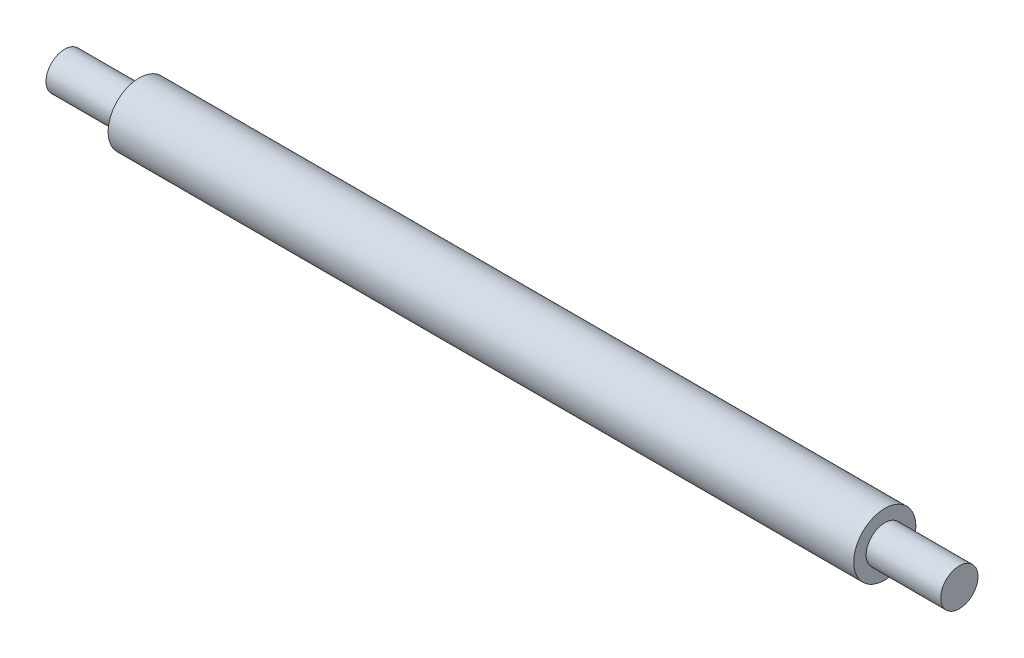
ISO-10303-21;
HEADER;
FILE_DESCRIPTION(('STEP AP214'),'2;1');
FILE_NAME('part.step','',(''),(''),'','','');
FILE_SCHEMA(('AUTOMOTIVE_DESIGN { 1 0 10303 214 1 1 1 1 }'));
ENDSEC;
DATA;
#1=APPLICATION_CONTEXT('core data for automotive mechanical design processes');
#2=APPLICATION_PROTOCOL_DEFINITION('international standard','automotive_design',2000,#1);
#3=PRODUCT_CONTEXT('',#1,'mechanical');
#4=PRODUCT('Part','Part','',(#3));
#5=PRODUCT_RELATED_PRODUCT_CATEGORY('part','',(#4));
#6=PRODUCT_DEFINITION_FORMATION('','',#4);
#7=PRODUCT_DEFINITION_CONTEXT('part definition',#1,'design');
#8=PRODUCT_DEFINITION('design','',#6,#7);
#9=PRODUCT_DEFINITION_SHAPE('','',#8);
#10=(LENGTH_UNIT() NAMED_UNIT(*) SI_UNIT(.MILLI.,.METRE.));
#11=(NAMED_UNIT(*) PLANE_ANGLE_UNIT() SI_UNIT($,.RADIAN.));
#12=(NAMED_UNIT(*) SI_UNIT($,.STERADIAN.) SOLID_ANGLE_UNIT());
#13=UNCERTAINTY_MEASURE_WITH_UNIT(LENGTH_MEASURE(1.E-05),#10,'distance_accuracy_value','');
#14=(GEOMETRIC_REPRESENTATION_CONTEXT(3) GLOBAL_UNCERTAINTY_ASSIGNED_CONTEXT((#13)) GLOBAL_UNIT_ASSIGNED_CONTEXT((#10,
#11,#12)) REPRESENTATION_CONTEXT('',''));
#15=CARTESIAN_POINT('',(0.,0.,0.));
#16=DIRECTION('',(0.,0.,1.));
#17=DIRECTION('',(1.,0.,0.));
#18=AXIS2_PLACEMENT_3D('',#15,#16,#17);
#19=CARTESIAN_POINT('',(-30.,0.,0.));
#20=DIRECTION('',(1.,0.,0.));
#21=DIRECTION('',(0.,0.,-1.));
#22=AXIS2_PLACEMENT_3D('',#19,#20,#21);
#23=CYLINDRICAL_SURFACE('',#22,2.5);
#24=CARTESIAN_POINT('',(-30.,0.,0.));
#25=DIRECTION('',(1.,0.,0.));
#26=DIRECTION('',(0.,0.,-1.));
#27=AXIS2_PLACEMENT_3D('',#24,#25,#26);
#28=CIRCLE('',#27,2.5);
#29=CARTESIAN_POINT('',(-30.,0.,-2.5));
#30=VERTEX_POINT('',#29);
#31=EDGE_CURVE('E37',#30,#30,#28,.T.);
#32=ORIENTED_EDGE('',*,*,#31,.T.);
#33=EDGE_LOOP('',(#32));
#34=FACE_BOUND('',#33,.T.);
#35=CARTESIAN_POINT('',(30.,0.,0.));
#36=DIRECTION('',(1.,0.,0.));
#37=DIRECTION('',(0.,0.,-1.));
#38=AXIS2_PLACEMENT_3D('',#35,#36,#37);
#39=CIRCLE('',#38,2.5);
#40=CARTESIAN_POINT('',(30.,0.,-2.5));
#41=VERTEX_POINT('',#40);
#42=EDGE_CURVE('E52',#41,#41,#39,.T.);
#43=ORIENTED_EDGE('',*,*,#42,.F.);
#44=EDGE_LOOP('',(#43));
#45=FACE_BOUND('',#44,.T.);
#46=ADVANCED_FACE('F34',(#34,#45),#23,.T.);
#47=CARTESIAN_POINT('',(-30.,0.,0.));
#48=DIRECTION('',(1.,0.,0.));
#49=DIRECTION('',(0.,0.,-1.));
#50=AXIS2_PLACEMENT_3D('',#47,#48,#49);
#51=PLANE('',#50);
#52=CARTESIAN_POINT('',(-30.,0.,0.));
#53=DIRECTION('',(-1.,0.,0.));
#54=DIRECTION('',(0.,0.,1.));
#55=AXIS2_PLACEMENT_3D('',#52,#53,#54);
#56=CIRCLE('',#55,1.5);
#57=CARTESIAN_POINT('',(-30.,0.,1.5));
#58=VERTEX_POINT('',#57);
#59=EDGE_CURVE('E10',#58,#58,#56,.T.);
#60=ORIENTED_EDGE('',*,*,#59,.F.);
#61=EDGE_LOOP('',(#60));
#62=FACE_BOUND('',#61,.T.);
#63=ORIENTED_EDGE('',*,*,#31,.F.);
#64=EDGE_LOOP('',(#63));
#65=FACE_BOUND('',#64,.T.);
#66=ADVANCED_FACE('F61',(#62,#65),#51,.F.);
#67=CARTESIAN_POINT('',(30.,0.,0.));
#68=DIRECTION('',(1.,0.,0.));
#69=DIRECTION('',(0.,0.,-1.));
#70=AXIS2_PLACEMENT_3D('',#67,#68,#69);
#71=PLANE('',#70);
#72=CARTESIAN_POINT('',(30.,0.,0.));
#73=DIRECTION('',(1.,0.,0.));
#74=DIRECTION('',(0.,0.,-1.));
#75=AXIS2_PLACEMENT_3D('',#72,#73,#74);
#76=CIRCLE('',#75,1.5);
#77=CARTESIAN_POINT('',(30.,0.,-1.5));
#78=VERTEX_POINT('',#77);
#79=EDGE_CURVE('E41',#78,#78,#76,.T.);
#80=ORIENTED_EDGE('',*,*,#79,.F.);
#81=EDGE_LOOP('',(#80));
#82=FACE_BOUND('',#81,.T.);
#83=ORIENTED_EDGE('',*,*,#42,.T.);
#84=EDGE_LOOP('',(#83));
#85=FACE_BOUND('',#84,.T.);
#86=ADVANCED_FACE('F63',(#82,#85),#71,.T.);
#87=CARTESIAN_POINT('',(36.,0.,0.));
#88=DIRECTION('',(-1.,0.,0.));
#89=DIRECTION('',(0.,0.,1.));
#90=AXIS2_PLACEMENT_3D('',#87,#88,#89);
#91=CYLINDRICAL_SURFACE('',#90,1.5);
#92=CARTESIAN_POINT('',(36.,0.,0.));
#93=DIRECTION('',(1.,0.,0.));
#94=DIRECTION('',(0.,0.,-1.));
#95=AXIS2_PLACEMENT_3D('',#92,#93,#94);
#96=CIRCLE('',#95,1.5);
#97=CARTESIAN_POINT('',(36.,0.,-1.5));
#98=VERTEX_POINT('',#97);
#99=EDGE_CURVE('E50',#98,#98,#96,.T.);
#100=ORIENTED_EDGE('',*,*,#99,.F.);
#101=EDGE_LOOP('',(#100));
#102=FACE_BOUND('',#101,.T.);
#103=ORIENTED_EDGE('',*,*,#79,.T.);
#104=EDGE_LOOP('',(#103));
#105=FACE_BOUND('',#104,.T.);
#106=ADVANCED_FACE('F69',(#102,#105),#91,.T.);
#107=CARTESIAN_POINT('',(36.,0.,0.));
#108=DIRECTION('',(1.,0.,0.));
#109=DIRECTION('',(0.,0.,-1.));
#110=AXIS2_PLACEMENT_3D('',#107,#108,#109);
#111=PLANE('',#110);
#112=ORIENTED_EDGE('',*,*,#99,.T.);
#113=EDGE_LOOP('',(#112));
#114=FACE_BOUND('',#113,.T.);
#115=ADVANCED_FACE('F75',(#114),#111,.T.);
#116=CARTESIAN_POINT('',(-36.,0.,0.));
#117=DIRECTION('',(1.,0.,0.));
#118=DIRECTION('',(0.,0.,-1.));
#119=AXIS2_PLACEMENT_3D('',#116,#117,#118);
#120=CYLINDRICAL_SURFACE('',#119,1.5);
#121=CARTESIAN_POINT('',(-36.,0.,0.));
#122=DIRECTION('',(-1.,0.,0.));
#123=DIRECTION('',(0.,0.,1.));
#124=AXIS2_PLACEMENT_3D('',#121,#122,#123);
#125=CIRCLE('',#124,1.5);
#126=CARTESIAN_POINT('',(-36.,0.,1.5));
#127=VERTEX_POINT('',#126);
#128=EDGE_CURVE('E49',#127,#127,#125,.T.);
#129=ORIENTED_EDGE('',*,*,#128,.F.);
#130=EDGE_LOOP('',(#129));
#131=FACE_BOUND('',#130,.T.);
#132=ORIENTED_EDGE('',*,*,#59,.T.);
#133=EDGE_LOOP('',(#132));
#134=FACE_BOUND('',#133,.T.);
#135=ADVANCED_FACE('F79',(#131,#134),#120,.T.);
#136=CARTESIAN_POINT('',(-36.,0.,0.));
#137=DIRECTION('',(-1.,0.,0.));
#138=DIRECTION('',(0.,0.,1.));
#139=AXIS2_PLACEMENT_3D('',#136,#137,#138);
#140=PLANE('',#139);
#141=ORIENTED_EDGE('',*,*,#128,.T.);
#142=EDGE_LOOP('',(#141));
#143=FACE_BOUND('',#142,.T.);
#144=ADVANCED_FACE('F83',(#143),#140,.T.);
#145=CLOSED_SHELL('',(#46,#66,#86,#106,#115,#135,#144));
#146=MANIFOLD_SOLID_BREP('B2',#145);
#147=ADVANCED_BREP_SHAPE_REPRESENTATION('',(#18,#146),#14);
#148=SHAPE_DEFINITION_REPRESENTATION(#9,#147);
ENDSEC;
END-ISO-10303-21;
